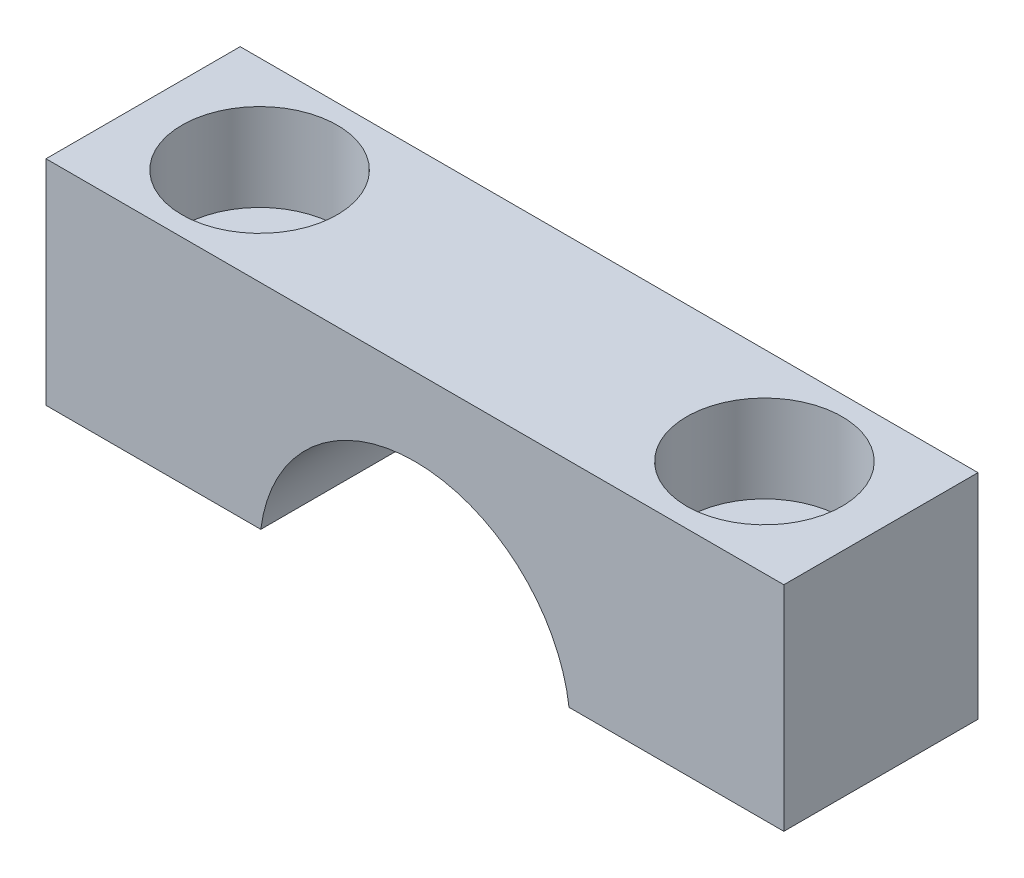
ISO-10303-21;
HEADER;
FILE_DESCRIPTION(('STEP AP214'),'2;1');
FILE_NAME('part.step','',(''),(''),'','','');
FILE_SCHEMA(('AUTOMOTIVE_DESIGN { 1 0 10303 214 1 1 1 1 }'));
ENDSEC;
DATA;
#1=APPLICATION_CONTEXT('core data for automotive mechanical design processes');
#2=APPLICATION_PROTOCOL_DEFINITION('international standard','automotive_design',2000,#1);
#3=PRODUCT_CONTEXT('',#1,'mechanical');
#4=PRODUCT('Part','Part','',(#3));
#5=PRODUCT_RELATED_PRODUCT_CATEGORY('part','',(#4));
#6=PRODUCT_DEFINITION_FORMATION('','',#4);
#7=PRODUCT_DEFINITION_CONTEXT('part definition',#1,'design');
#8=PRODUCT_DEFINITION('design','',#6,#7);
#9=PRODUCT_DEFINITION_SHAPE('','',#8);
#10=(LENGTH_UNIT() NAMED_UNIT(*) SI_UNIT(.MILLI.,.METRE.));
#11=(NAMED_UNIT(*) PLANE_ANGLE_UNIT() SI_UNIT($,.RADIAN.));
#12=(NAMED_UNIT(*) SI_UNIT($,.STERADIAN.) SOLID_ANGLE_UNIT());
#13=UNCERTAINTY_MEASURE_WITH_UNIT(LENGTH_MEASURE(1.E-05),#10,'distance_accuracy_value','');
#14=(GEOMETRIC_REPRESENTATION_CONTEXT(3) GLOBAL_UNCERTAINTY_ASSIGNED_CONTEXT((#13)) GLOBAL_UNIT_ASSIGNED_CONTEXT((#10,
#11,#12)) REPRESENTATION_CONTEXT('',''));
#15=CARTESIAN_POINT('',(0.,0.,0.));
#16=DIRECTION('',(0.,0.,1.));
#17=DIRECTION('',(1.,0.,0.));
#18=AXIS2_PLACEMENT_3D('',#15,#16,#17);
#19=CARTESIAN_POINT('',(17.,7.5,0.));
#20=DIRECTION('',(0.,1.,0.));
#21=DIRECTION('',(0.,0.,1.));
#22=AXIS2_PLACEMENT_3D('',#19,#20,#21);
#23=PLANE('',#22);
#24=CARTESIAN_POINT('',(13.,7.5,0.));
#25=DIRECTION('',(0.,1.,0.));
#26=DIRECTION('',(0.,0.,1.));
#27=AXIS2_PLACEMENT_3D('',#24,#25,#26);
#28=CIRCLE('',#27,2.25);
#29=CARTESIAN_POINT('',(13.,7.5,2.25));
#30=VERTEX_POINT('',#29);
#31=EDGE_CURVE('E170',#30,#30,#28,.F.);
#32=ORIENTED_EDGE('',*,*,#31,.T.);
#33=EDGE_LOOP('',(#32));
#34=FACE_BOUND('',#33,.T.);
#35=CARTESIAN_POINT('',(13.,7.5,0.));
#36=DIRECTION('',(0.,1.,0.));
#37=DIRECTION('',(0.,0.,1.));
#38=AXIS2_PLACEMENT_3D('',#35,#36,#37);
#39=CIRCLE('',#38,4.);
#40=CARTESIAN_POINT('',(13.,7.5,4.));
#41=VERTEX_POINT('',#40);
#42=EDGE_CURVE('E167',#41,#41,#39,.T.);
#43=ORIENTED_EDGE('',*,*,#42,.T.);
#44=EDGE_LOOP('',(#43));
#45=FACE_BOUND('',#44,.T.);
#46=ADVANCED_FACE('F17',(#34,#45),#23,.T.);
#47=CARTESIAN_POINT('',(-9.,7.5,0.));
#48=DIRECTION('',(0.,1.,0.));
#49=DIRECTION('',(0.,0.,1.));
#50=AXIS2_PLACEMENT_3D('',#47,#48,#49);
#51=PLANE('',#50);
#52=CARTESIAN_POINT('',(-13.,7.5,0.));
#53=DIRECTION('',(0.,1.,0.));
#54=DIRECTION('',(0.,0.,1.));
#55=AXIS2_PLACEMENT_3D('',#52,#53,#54);
#56=CIRCLE('',#55,2.25);
#57=CARTESIAN_POINT('',(-13.,7.5,2.25));
#58=VERTEX_POINT('',#57);
#59=EDGE_CURVE('E20',#58,#58,#56,.F.);
#60=ORIENTED_EDGE('',*,*,#59,.T.);
#61=EDGE_LOOP('',(#60));
#62=FACE_BOUND('',#61,.T.);
#63=CARTESIAN_POINT('',(-13.,7.5,0.));
#64=DIRECTION('',(0.,1.,0.));
#65=DIRECTION('',(0.,0.,1.));
#66=AXIS2_PLACEMENT_3D('',#63,#64,#65);
#67=CIRCLE('',#66,4.);
#68=CARTESIAN_POINT('',(-13.,7.5,4.));
#69=VERTEX_POINT('',#68);
#70=EDGE_CURVE('E131',#69,#69,#67,.T.);
#71=ORIENTED_EDGE('',*,*,#70,.T.);
#72=EDGE_LOOP('',(#71));
#73=FACE_BOUND('',#72,.T.);
#74=ADVANCED_FACE('F181',(#62,#73),#51,.T.);
#75=CARTESIAN_POINT('',(-13.,1.,0.));
#76=DIRECTION('',(0.,1.,0.));
#77=DIRECTION('',(0.,0.,1.));
#78=AXIS2_PLACEMENT_3D('',#75,#76,#77);
#79=CYLINDRICAL_SURFACE('',#78,2.25);
#80=ORIENTED_EDGE('',*,*,#59,.F.);
#81=EDGE_LOOP('',(#80));
#82=FACE_BOUND('',#81,.T.);
#83=CARTESIAN_POINT('',(-13.,1.,0.));
#84=DIRECTION('',(0.,1.,0.));
#85=DIRECTION('',(0.,0.,1.));
#86=AXIS2_PLACEMENT_3D('',#83,#84,#85);
#87=CIRCLE('',#86,2.25);
#88=CARTESIAN_POINT('',(-13.,1.,2.25));
#89=VERTEX_POINT('',#88);
#90=EDGE_CURVE('E82',#89,#89,#87,.F.);
#91=ORIENTED_EDGE('',*,*,#90,.T.);
#92=EDGE_LOOP('',(#91));
#93=FACE_BOUND('',#92,.T.);
#94=ADVANCED_FACE('F184',(#82,#93),#79,.F.);
#95=CARTESIAN_POINT('',(13.,1.,0.));
#96=DIRECTION('',(0.,1.,0.));
#97=DIRECTION('',(0.,0.,1.));
#98=AXIS2_PLACEMENT_3D('',#95,#96,#97);
#99=CYLINDRICAL_SURFACE('',#98,2.25);
#100=ORIENTED_EDGE('',*,*,#31,.F.);
#101=EDGE_LOOP('',(#100));
#102=FACE_BOUND('',#101,.T.);
#103=CARTESIAN_POINT('',(13.,1.,0.));
#104=DIRECTION('',(0.,1.,0.));
#105=DIRECTION('',(0.,0.,1.));
#106=AXIS2_PLACEMENT_3D('',#103,#104,#105);
#107=CIRCLE('',#106,2.25);
#108=CARTESIAN_POINT('',(13.,1.,2.25));
#109=VERTEX_POINT('',#108);
#110=EDGE_CURVE('E141',#109,#109,#107,.F.);
#111=ORIENTED_EDGE('',*,*,#110,.T.);
#112=EDGE_LOOP('',(#111));
#113=FACE_BOUND('',#112,.T.);
#114=ADVANCED_FACE('F187',(#102,#113),#99,.F.);
#115=CARTESIAN_POINT('',(0.,0.,-5.));
#116=DIRECTION('',(0.,0.,1.));
#117=DIRECTION('',(1.,0.,0.));
#118=AXIS2_PLACEMENT_3D('',#115,#116,#117);
#119=PLANE('',#118);
#120=DIRECTION('',(1.,0.,0.));
#121=VECTOR('',#120,1.);
#122=CARTESIAN_POINT('',(19.,12.,-5.));
#123=LINE('',#122,#121);
#124=CARTESIAN_POINT('',(-19.,12.,-5.));
#125=VERTEX_POINT('',#124);
#126=CARTESIAN_POINT('',(19.,12.,-5.));
#127=VERTEX_POINT('',#126);
#128=EDGE_CURVE('E124',#125,#127,#123,.T.);
#129=ORIENTED_EDGE('',*,*,#128,.T.);
#130=DIRECTION('',(0.,1.,0.));
#131=VECTOR('',#130,1.);
#132=CARTESIAN_POINT('',(19.,1.,-5.));
#133=LINE('',#132,#131);
#134=CARTESIAN_POINT('',(19.,1.,-5.));
#135=VERTEX_POINT('',#134);
#136=EDGE_CURVE('E144',#127,#135,#133,.F.);
#137=ORIENTED_EDGE('',*,*,#136,.T.);
#138=DIRECTION('',(1.,0.,0.));
#139=VECTOR('',#138,1.);
#140=CARTESIAN_POINT('',(7.93725393319377,1.,-5.));
#141=LINE('',#140,#139);
#142=CARTESIAN_POINT('',(7.93725393319377,1.,-5.));
#143=VERTEX_POINT('',#142);
#144=EDGE_CURVE('E87',#135,#143,#141,.F.);
#145=ORIENTED_EDGE('',*,*,#144,.T.);
#146=CARTESIAN_POINT('',(0.,0.,-5.));
#147=DIRECTION('',(0.,0.,1.));
#148=DIRECTION('',(1.,0.,0.));
#149=AXIS2_PLACEMENT_3D('',#146,#147,#148);
#150=CIRCLE('',#149,8.);
#151=CARTESIAN_POINT('',(-7.93725393319377,1.,-5.));
#152=VERTEX_POINT('',#151);
#153=EDGE_CURVE('E68',#143,#152,#150,.T.);
#154=ORIENTED_EDGE('',*,*,#153,.T.);
#155=DIRECTION('',(1.,0.,0.));
#156=VECTOR('',#155,1.);
#157=CARTESIAN_POINT('',(-19.,1.,-5.));
#158=LINE('',#157,#156);
#159=CARTESIAN_POINT('',(-19.,1.,-5.));
#160=VERTEX_POINT('',#159);
#161=EDGE_CURVE('E74',#152,#160,#158,.F.);
#162=ORIENTED_EDGE('',*,*,#161,.T.);
#163=DIRECTION('',(0.,1.,0.));
#164=VECTOR('',#163,1.);
#165=CARTESIAN_POINT('',(-19.,12.,-5.));
#166=LINE('',#165,#164);
#167=EDGE_CURVE('E109',#160,#125,#166,.T.);
#168=ORIENTED_EDGE('',*,*,#167,.T.);
#169=EDGE_LOOP('',(#129,#137,#145,#154,#162,#168));
#170=FACE_BOUND('',#169,.T.);
#171=ADVANCED_FACE('F85',(#170),#119,.F.);
#172=CARTESIAN_POINT('',(13.,1.,0.));
#173=DIRECTION('',(0.,1.,0.));
#174=DIRECTION('',(0.,0.,1.));
#175=AXIS2_PLACEMENT_3D('',#172,#173,#174);
#176=CYLINDRICAL_SURFACE('',#175,4.);
#177=ORIENTED_EDGE('',*,*,#42,.F.);
#178=EDGE_LOOP('',(#177));
#179=FACE_BOUND('',#178,.T.);
#180=CARTESIAN_POINT('',(13.,12.,0.));
#181=DIRECTION('',(0.,1.,0.));
#182=DIRECTION('',(0.,0.,1.));
#183=AXIS2_PLACEMENT_3D('',#180,#181,#182);
#184=CIRCLE('',#183,4.);
#185=CARTESIAN_POINT('',(13.,12.,4.));
#186=VERTEX_POINT('',#185);
#187=EDGE_CURVE('E136',#186,#186,#184,.T.);
#188=ORIENTED_EDGE('',*,*,#187,.T.);
#189=EDGE_LOOP('',(#188));
#190=FACE_BOUND('',#189,.T.);
#191=ADVANCED_FACE('F250',(#179,#190),#176,.F.);
#192=CARTESIAN_POINT('',(-13.,1.,0.));
#193=DIRECTION('',(0.,1.,0.));
#194=DIRECTION('',(0.,0.,1.));
#195=AXIS2_PLACEMENT_3D('',#192,#193,#194);
#196=CYLINDRICAL_SURFACE('',#195,4.);
#197=ORIENTED_EDGE('',*,*,#70,.F.);
#198=EDGE_LOOP('',(#197));
#199=FACE_BOUND('',#198,.T.);
#200=CARTESIAN_POINT('',(-13.,12.,0.));
#201=DIRECTION('',(0.,1.,0.));
#202=DIRECTION('',(0.,0.,1.));
#203=AXIS2_PLACEMENT_3D('',#200,#201,#202);
#204=CIRCLE('',#203,4.);
#205=CARTESIAN_POINT('',(-13.,12.,4.));
#206=VERTEX_POINT('',#205);
#207=EDGE_CURVE('E117',#206,#206,#204,.T.);
#208=ORIENTED_EDGE('',*,*,#207,.T.);
#209=EDGE_LOOP('',(#208));
#210=FACE_BOUND('',#209,.T.);
#211=ADVANCED_FACE('F200',(#199,#210),#196,.F.);
#212=CARTESIAN_POINT('',(-19.,12.,5.));
#213=DIRECTION('',(1.,0.,0.));
#214=DIRECTION('',(0.,0.,-1.));
#215=AXIS2_PLACEMENT_3D('',#212,#213,#214);
#216=PLANE('',#215);
#217=DIRECTION('',(0.,0.,1.));
#218=VECTOR('',#217,1.);
#219=CARTESIAN_POINT('',(-19.,1.,5.));
#220=LINE('',#219,#218);
#221=CARTESIAN_POINT('',(-19.,1.,5.));
#222=VERTEX_POINT('',#221);
#223=EDGE_CURVE('E79',#160,#222,#220,.T.);
#224=ORIENTED_EDGE('',*,*,#223,.T.);
#225=DIRECTION('',(0.,1.,0.));
#226=VECTOR('',#225,1.);
#227=CARTESIAN_POINT('',(-19.,0.,5.));
#228=LINE('',#227,#226);
#229=CARTESIAN_POINT('',(-19.,12.,5.));
#230=VERTEX_POINT('',#229);
#231=EDGE_CURVE('E112',#230,#222,#228,.F.);
#232=ORIENTED_EDGE('',*,*,#231,.F.);
#233=DIRECTION('',(0.,0.,-1.));
#234=VECTOR('',#233,1.);
#235=CARTESIAN_POINT('',(-19.,12.,5.));
#236=LINE('',#235,#234);
#237=EDGE_CURVE('E120',#230,#125,#236,.T.);
#238=ORIENTED_EDGE('',*,*,#237,.T.);
#239=ORIENTED_EDGE('',*,*,#167,.F.);
#240=EDGE_LOOP('',(#224,#232,#238,#239));
#241=FACE_BOUND('',#240,.T.);
#242=ADVANCED_FACE('F192',(#241),#216,.F.);
#243=CARTESIAN_POINT('',(-19.,1.,5.));
#244=DIRECTION('',(0.,1.,0.));
#245=DIRECTION('',(0.,0.,1.));
#246=AXIS2_PLACEMENT_3D('',#243,#244,#245);
#247=PLANE('',#246);
#248=ORIENTED_EDGE('',*,*,#90,.F.);
#249=EDGE_LOOP('',(#248));
#250=FACE_BOUND('',#249,.T.);
#251=DIRECTION('',(0.,0.,1.));
#252=VECTOR('',#251,1.);
#253=CARTESIAN_POINT('',(-7.93725393319377,1.,5.));
#254=LINE('',#253,#252);
#255=CARTESIAN_POINT('',(-7.93725393319377,1.,5.));
#256=VERTEX_POINT('',#255);
#257=EDGE_CURVE('E77',#152,#256,#254,.T.);
#258=ORIENTED_EDGE('',*,*,#257,.T.);
#259=DIRECTION('',(1.,0.,0.));
#260=VECTOR('',#259,1.);
#261=CARTESIAN_POINT('',(0.,1.,5.));
#262=LINE('',#261,#260);
#263=EDGE_CURVE('E116',#222,#256,#262,.T.);
#264=ORIENTED_EDGE('',*,*,#263,.F.);
#265=ORIENTED_EDGE('',*,*,#223,.F.);
#266=ORIENTED_EDGE('',*,*,#161,.F.);
#267=EDGE_LOOP('',(#258,#264,#265,#266));
#268=FACE_BOUND('',#267,.T.);
#269=ADVANCED_FACE('F75',(#250,#268),#247,.F.);
#270=CARTESIAN_POINT('',(0.,0.,5.));
#271=DIRECTION('',(0.,0.,1.));
#272=DIRECTION('',(1.,0.,0.));
#273=AXIS2_PLACEMENT_3D('',#270,#271,#272);
#274=CYLINDRICAL_SURFACE('',#273,8.);
#275=DIRECTION('',(0.,0.,1.));
#276=VECTOR('',#275,1.);
#277=CARTESIAN_POINT('',(7.93725393319377,1.,5.));
#278=LINE('',#277,#276);
#279=CARTESIAN_POINT('',(7.93725393319377,1.,5.));
#280=VERTEX_POINT('',#279);
#281=EDGE_CURVE('E90',#143,#280,#278,.T.);
#282=ORIENTED_EDGE('',*,*,#281,.T.);
#283=CARTESIAN_POINT('',(0.,0.,5.));
#284=DIRECTION('',(0.,0.,1.));
#285=DIRECTION('',(1.,0.,0.));
#286=AXIS2_PLACEMENT_3D('',#283,#284,#285);
#287=CIRCLE('',#286,8.);
#288=EDGE_CURVE('E94',#256,#280,#287,.F.);
#289=ORIENTED_EDGE('',*,*,#288,.F.);
#290=ORIENTED_EDGE('',*,*,#257,.F.);
#291=ORIENTED_EDGE('',*,*,#153,.F.);
#292=EDGE_LOOP('',(#282,#289,#290,#291));
#293=FACE_BOUND('',#292,.T.);
#294=ADVANCED_FACE('F92',(#293),#274,.F.);
#295=CARTESIAN_POINT('',(7.93725393319377,1.,5.));
#296=DIRECTION('',(0.,1.,0.));
#297=DIRECTION('',(0.,0.,1.));
#298=AXIS2_PLACEMENT_3D('',#295,#296,#297);
#299=PLANE('',#298);
#300=ORIENTED_EDGE('',*,*,#110,.F.);
#301=EDGE_LOOP('',(#300));
#302=FACE_BOUND('',#301,.T.);
#303=DIRECTION('',(0.,0.,1.));
#304=VECTOR('',#303,1.);
#305=CARTESIAN_POINT('',(19.,1.,5.));
#306=LINE('',#305,#304);
#307=CARTESIAN_POINT('',(19.,1.,5.));
#308=VERTEX_POINT('',#307);
#309=EDGE_CURVE('E147',#135,#308,#306,.T.);
#310=ORIENTED_EDGE('',*,*,#309,.T.);
#311=DIRECTION('',(1.,0.,0.));
#312=VECTOR('',#311,1.);
#313=CARTESIAN_POINT('',(0.,1.,5.));
#314=LINE('',#313,#312);
#315=EDGE_CURVE('E154',#280,#308,#314,.T.);
#316=ORIENTED_EDGE('',*,*,#315,.F.);
#317=ORIENTED_EDGE('',*,*,#281,.F.);
#318=ORIENTED_EDGE('',*,*,#144,.F.);
#319=EDGE_LOOP('',(#310,#316,#317,#318));
#320=FACE_BOUND('',#319,.T.);
#321=ADVANCED_FACE('F198',(#302,#320),#299,.F.);
#322=CARTESIAN_POINT('',(19.,1.,5.));
#323=DIRECTION('',(-1.,0.,0.));
#324=DIRECTION('',(0.,0.,1.));
#325=AXIS2_PLACEMENT_3D('',#322,#323,#324);
#326=PLANE('',#325);
#327=DIRECTION('',(0.,0.,-1.));
#328=VECTOR('',#327,1.);
#329=CARTESIAN_POINT('',(19.,12.,5.));
#330=LINE('',#329,#328);
#331=CARTESIAN_POINT('',(19.,12.,5.));
#332=VERTEX_POINT('',#331);
#333=EDGE_CURVE('E36',#127,#332,#330,.F.);
#334=ORIENTED_EDGE('',*,*,#333,.T.);
#335=DIRECTION('',(0.,1.,0.));
#336=VECTOR('',#335,1.);
#337=CARTESIAN_POINT('',(19.,0.,5.));
#338=LINE('',#337,#336);
#339=EDGE_CURVE('E27',#308,#332,#338,.T.);
#340=ORIENTED_EDGE('',*,*,#339,.F.);
#341=ORIENTED_EDGE('',*,*,#309,.F.);
#342=ORIENTED_EDGE('',*,*,#136,.F.);
#343=EDGE_LOOP('',(#334,#340,#341,#342));
#344=FACE_BOUND('',#343,.T.);
#345=ADVANCED_FACE('F210',(#344),#326,.F.);
#346=CARTESIAN_POINT('',(19.,12.,5.));
#347=DIRECTION('',(0.,-1.,0.));
#348=DIRECTION('',(0.,0.,-1.));
#349=AXIS2_PLACEMENT_3D('',#346,#347,#348);
#350=PLANE('',#349);
#351=ORIENTED_EDGE('',*,*,#207,.F.);
#352=EDGE_LOOP('',(#351));
#353=FACE_BOUND('',#352,.T.);
#354=ORIENTED_EDGE('',*,*,#187,.F.);
#355=EDGE_LOOP('',(#354));
#356=FACE_BOUND('',#355,.T.);
#357=ORIENTED_EDGE('',*,*,#237,.F.);
#358=DIRECTION('',(1.,0.,0.));
#359=VECTOR('',#358,1.);
#360=CARTESIAN_POINT('',(0.,12.,5.));
#361=LINE('',#360,#359);
#362=EDGE_CURVE('E11',#332,#230,#361,.F.);
#363=ORIENTED_EDGE('',*,*,#362,.F.);
#364=ORIENTED_EDGE('',*,*,#333,.F.);
#365=ORIENTED_EDGE('',*,*,#128,.F.);
#366=EDGE_LOOP('',(#357,#363,#364,#365));
#367=FACE_BOUND('',#366,.T.);
#368=ADVANCED_FACE('F205',(#353,#356,#367),#350,.F.);
#369=CARTESIAN_POINT('',(0.,0.,5.));
#370=DIRECTION('',(0.,0.,1.));
#371=DIRECTION('',(1.,0.,0.));
#372=AXIS2_PLACEMENT_3D('',#369,#370,#371);
#373=PLANE('',#372);
#374=ORIENTED_EDGE('',*,*,#339,.T.);
#375=ORIENTED_EDGE('',*,*,#362,.T.);
#376=ORIENTED_EDGE('',*,*,#231,.T.);
#377=ORIENTED_EDGE('',*,*,#263,.T.);
#378=ORIENTED_EDGE('',*,*,#288,.T.);
#379=ORIENTED_EDGE('',*,*,#315,.T.);
#380=EDGE_LOOP('',(#374,#375,#376,#377,#378,#379));
#381=FACE_BOUND('',#380,.T.);
#382=ADVANCED_FACE('F203',(#381),#373,.T.);
#383=CLOSED_SHELL('',(#46,#74,#94,#114,#171,#191,#211,#242,#269,#294,#321,#345,#368,#382));
#384=MANIFOLD_SOLID_BREP('B1',#383);
#385=ADVANCED_BREP_SHAPE_REPRESENTATION('',(#18,#384),#14);
#386=SHAPE_DEFINITION_REPRESENTATION(#9,#385);
ENDSEC;
END-ISO-10303-21;
